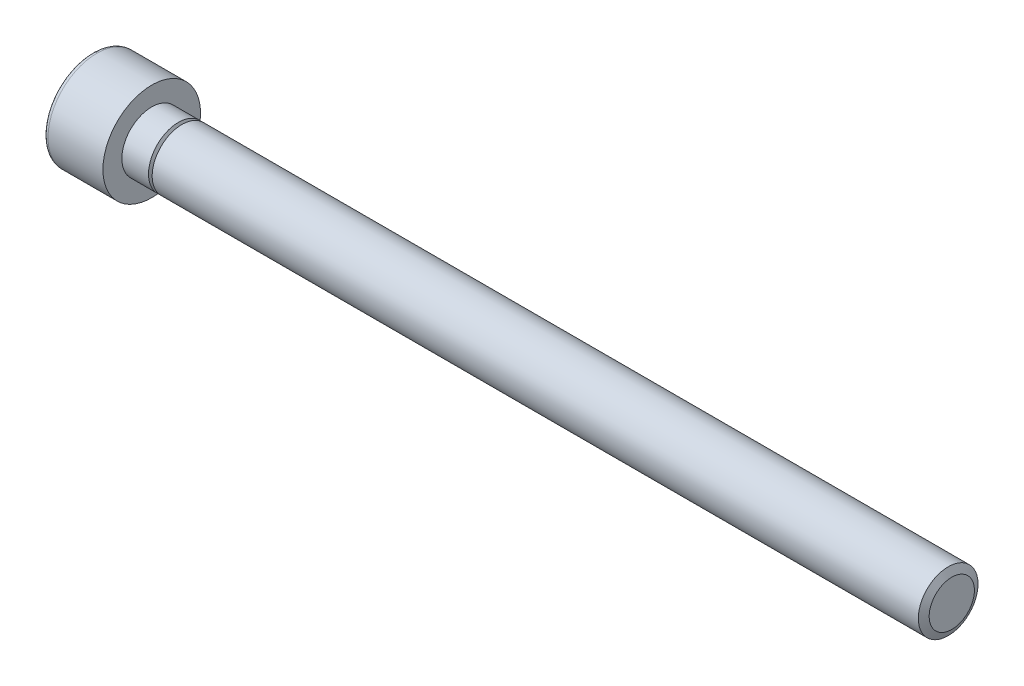
ISO-10303-21;
HEADER;
FILE_DESCRIPTION(('STEP AP214'),'2;1');
FILE_NAME('part.step','',(''),(''),'','','');
FILE_SCHEMA(('AUTOMOTIVE_DESIGN { 1 0 10303 214 1 1 1 1 }'));
ENDSEC;
DATA;
#1=APPLICATION_CONTEXT('core data for automotive mechanical design processes');
#2=APPLICATION_PROTOCOL_DEFINITION('international standard','automotive_design',2000,#1);
#3=PRODUCT_CONTEXT('',#1,'mechanical');
#4=PRODUCT('Part','Part','',(#3));
#5=PRODUCT_RELATED_PRODUCT_CATEGORY('part','',(#4));
#6=PRODUCT_DEFINITION_FORMATION('','',#4);
#7=PRODUCT_DEFINITION_CONTEXT('part definition',#1,'design');
#8=PRODUCT_DEFINITION('design','',#6,#7);
#9=PRODUCT_DEFINITION_SHAPE('','',#8);
#10=(LENGTH_UNIT() NAMED_UNIT(*) SI_UNIT(.MILLI.,.METRE.));
#11=(NAMED_UNIT(*) PLANE_ANGLE_UNIT() SI_UNIT($,.RADIAN.));
#12=(NAMED_UNIT(*) SI_UNIT($,.STERADIAN.) SOLID_ANGLE_UNIT());
#13=UNCERTAINTY_MEASURE_WITH_UNIT(LENGTH_MEASURE(1.E-05),#10,'distance_accuracy_value','');
#14=(GEOMETRIC_REPRESENTATION_CONTEXT(3) GLOBAL_UNCERTAINTY_ASSIGNED_CONTEXT((#13)) GLOBAL_UNIT_ASSIGNED_CONTEXT((#10,
#11,#12)) REPRESENTATION_CONTEXT('',''));
#15=CARTESIAN_POINT('',(0.,0.,0.));
#16=DIRECTION('',(0.,0.,1.));
#17=DIRECTION('',(1.,0.,0.));
#18=AXIS2_PLACEMENT_3D('',#15,#16,#17);
#19=CARTESIAN_POINT('',(-2.8448,0.,0.));
#20=DIRECTION('',(-1.,0.,0.));
#21=DIRECTION('',(0.,0.,1.));
#22=AXIS2_PLACEMENT_3D('',#19,#20,#21);
#23=PLANE('',#22);
#24=CARTESIAN_POINT('',(-2.8448,0.,0.));
#25=DIRECTION('',(-1.,0.,0.));
#26=DIRECTION('',(0.,0.,1.));
#27=AXIS2_PLACEMENT_3D('',#24,#25,#26);
#28=CIRCLE('',#27,2.0955);
#29=CARTESIAN_POINT('',(-2.8448,0.,2.0955));
#30=VERTEX_POINT('',#29);
#31=EDGE_CURVE('E105',#30,#30,#28,.T.);
#32=ORIENTED_EDGE('',*,*,#31,.T.);
#33=EDGE_LOOP('',(#32));
#34=FACE_BOUND('',#33,.T.);
#35=DIRECTION('',(0.,-1.,0.));
#36=VECTOR('',#35,1.);
#37=CARTESIAN_POINT('',(-2.8448,0.,1.1938));
#38=LINE('',#37,#36);
#39=CARTESIAN_POINT('',(-2.8448,0.689240751358576,1.1938));
#40=VERTEX_POINT('',#39);
#41=CARTESIAN_POINT('',(-2.8448,-0.689240751358574,1.1938));
#42=VERTEX_POINT('',#41);
#43=EDGE_CURVE('E133',#40,#42,#38,.T.);
#44=ORIENTED_EDGE('',*,*,#43,.T.);
#45=DIRECTION('',(0.,-0.5,-0.866025403784439));
#46=VECTOR('',#45,1.);
#47=CARTESIAN_POINT('',(-2.8448,-1.03386112703786,0.5969));
#48=LINE('',#47,#46);
#49=CARTESIAN_POINT('',(-2.8448,-1.37848150271715,0.));
#50=VERTEX_POINT('',#49);
#51=EDGE_CURVE('E9',#42,#50,#48,.T.);
#52=ORIENTED_EDGE('',*,*,#51,.T.);
#53=DIRECTION('',(0.,0.5,-0.866025403784439));
#54=VECTOR('',#53,1.);
#55=CARTESIAN_POINT('',(-2.8448,-1.03386112703786,-0.5969));
#56=LINE('',#55,#54);
#57=CARTESIAN_POINT('',(-2.8448,-0.689240751358576,-1.1938));
#58=VERTEX_POINT('',#57);
#59=EDGE_CURVE('E24',#50,#58,#56,.T.);
#60=ORIENTED_EDGE('',*,*,#59,.T.);
#61=DIRECTION('',(0.,1.,0.));
#62=VECTOR('',#61,1.);
#63=CARTESIAN_POINT('',(-2.8448,0.,-1.1938));
#64=LINE('',#63,#62);
#65=CARTESIAN_POINT('',(-2.8448,0.689240751358575,-1.1938));
#66=VERTEX_POINT('',#65);
#67=EDGE_CURVE('E145',#58,#66,#64,.T.);
#68=ORIENTED_EDGE('',*,*,#67,.T.);
#69=DIRECTION('',(0.,0.5,0.866025403784439));
#70=VECTOR('',#69,1.);
#71=CARTESIAN_POINT('',(-2.8448,1.03386112703786,-0.5969));
#72=LINE('',#71,#70);
#73=CARTESIAN_POINT('',(-2.8448,1.37848150271715,0.));
#74=VERTEX_POINT('',#73);
#75=EDGE_CURVE('E141',#66,#74,#72,.T.);
#76=ORIENTED_EDGE('',*,*,#75,.T.);
#77=DIRECTION('',(0.,-0.5,0.866025403784439));
#78=VECTOR('',#77,1.);
#79=CARTESIAN_POINT('',(-2.8448,1.03386112703786,0.5969));
#80=LINE('',#79,#78);
#81=EDGE_CURVE('E137',#74,#40,#80,.T.);
#82=ORIENTED_EDGE('',*,*,#81,.T.);
#83=EDGE_LOOP('',(#44,#52,#60,#68,#76,#82));
#84=FACE_BOUND('',#83,.T.);
#85=ADVANCED_FACE('F15',(#34,#84),#23,.T.);
#86=CARTESIAN_POINT('',(0.,-2.3241,0.));
#87=DIRECTION('',(1.,0.,0.));
#88=DIRECTION('',(0.,0.,-1.));
#89=AXIS2_PLACEMENT_3D('',#86,#87,#88);
#90=PLANE('',#89);
#91=CARTESIAN_POINT('',(0.,0.,0.));
#92=DIRECTION('',(-1.,0.,0.));
#93=DIRECTION('',(0.,0.,1.));
#94=AXIS2_PLACEMENT_3D('',#91,#92,#93);
#95=CIRCLE('',#94,1.4224);
#96=CARTESIAN_POINT('',(0.,0.,1.4224));
#97=VERTEX_POINT('',#96);
#98=EDGE_CURVE('E129',#97,#97,#95,.T.);
#99=ORIENTED_EDGE('',*,*,#98,.T.);
#100=EDGE_LOOP('',(#99));
#101=FACE_BOUND('',#100,.T.);
#102=CARTESIAN_POINT('',(0.,0.,0.));
#103=DIRECTION('',(-1.,0.,0.));
#104=DIRECTION('',(0.,0.,1.));
#105=AXIS2_PLACEMENT_3D('',#102,#103,#104);
#106=CIRCLE('',#105,2.3241);
#107=CARTESIAN_POINT('',(0.,0.,2.3241));
#108=VERTEX_POINT('',#107);
#109=EDGE_CURVE('E87',#108,#108,#106,.T.);
#110=ORIENTED_EDGE('',*,*,#109,.F.);
#111=EDGE_LOOP('',(#110));
#112=FACE_BOUND('',#111,.T.);
#113=ADVANCED_FACE('F17',(#101,#112),#90,.T.);
#114=CARTESIAN_POINT('',(-2.8448,0.,0.));
#115=DIRECTION('',(-1.,0.,0.));
#116=DIRECTION('',(0.,0.,1.));
#117=AXIS2_PLACEMENT_3D('',#114,#115,#116);
#118=CYLINDRICAL_SURFACE('',#117,1.4224);
#119=CARTESIAN_POINT('',(1.27,0.,0.));
#120=DIRECTION('',(-1.,0.,0.));
#121=DIRECTION('',(0.,0.,1.));
#122=AXIS2_PLACEMENT_3D('',#119,#120,#121);
#123=CIRCLE('',#122,1.4224);
#124=CARTESIAN_POINT('',(1.27,0.,1.4224));
#125=VERTEX_POINT('',#124);
#126=EDGE_CURVE('E125',#125,#125,#123,.T.);
#127=ORIENTED_EDGE('',*,*,#126,.T.);
#128=EDGE_LOOP('',(#127));
#129=FACE_BOUND('',#128,.T.);
#130=ORIENTED_EDGE('',*,*,#98,.F.);
#131=EDGE_LOOP('',(#130));
#132=FACE_BOUND('',#131,.T.);
#133=ADVANCED_FACE('F317',(#129,#132),#118,.T.);
#134=CARTESIAN_POINT('',(1.27,0.,0.));
#135=DIRECTION('',(-1.,0.,0.));
#136=DIRECTION('',(0.,0.,1.));
#137=AXIS2_PLACEMENT_3D('',#134,#135,#136);
#138=CONICAL_SURFACE('',#137,1.4224,1.10714871779409);
#139=CARTESIAN_POINT('',(1.442085,0.,0.));
#140=DIRECTION('',(-1.,0.,0.));
#141=DIRECTION('',(0.,0.,1.));
#142=AXIS2_PLACEMENT_3D('',#139,#140,#141);
#143=CIRCLE('',#142,1.07823);
#144=CARTESIAN_POINT('',(1.442085,0.,1.07823));
#145=VERTEX_POINT('',#144);
#146=EDGE_CURVE('E121',#145,#145,#143,.T.);
#147=ORIENTED_EDGE('',*,*,#146,.T.);
#148=EDGE_LOOP('',(#147));
#149=FACE_BOUND('',#148,.T.);
#150=ORIENTED_EDGE('',*,*,#126,.F.);
#151=EDGE_LOOP('',(#150));
#152=FACE_BOUND('',#151,.T.);
#153=ADVANCED_FACE('F307',(#149,#152),#138,.T.);
#154=CARTESIAN_POINT('',(1.442085,-1.07823,0.));
#155=DIRECTION('',(-1.,0.,0.));
#156=DIRECTION('',(0.,0.,1.));
#157=AXIS2_PLACEMENT_3D('',#154,#155,#156);
#158=PLANE('',#157);
#159=CARTESIAN_POINT('',(1.442085,0.,0.));
#160=DIRECTION('',(-1.,0.,0.));
#161=DIRECTION('',(0.,0.,1.));
#162=AXIS2_PLACEMENT_3D('',#159,#160,#161);
#163=CIRCLE('',#162,1.4224);
#164=CARTESIAN_POINT('',(1.442085,0.,1.4224));
#165=VERTEX_POINT('',#164);
#166=EDGE_CURVE('E117',#165,#165,#163,.T.);
#167=ORIENTED_EDGE('',*,*,#166,.T.);
#168=EDGE_LOOP('',(#167));
#169=FACE_BOUND('',#168,.T.);
#170=ORIENTED_EDGE('',*,*,#146,.F.);
#171=EDGE_LOOP('',(#170));
#172=FACE_BOUND('',#171,.T.);
#173=ADVANCED_FACE('F297',(#169,#172),#158,.T.);
#174=CARTESIAN_POINT('',(-2.8448,0.,0.));
#175=DIRECTION('',(-1.,0.,0.));
#176=DIRECTION('',(0.,0.,1.));
#177=AXIS2_PLACEMENT_3D('',#174,#175,#176);
#178=CYLINDRICAL_SURFACE('',#177,1.4224);
#179=CARTESIAN_POINT('',(37.927915,0.,0.));
#180=DIRECTION('',(-1.,0.,0.));
#181=DIRECTION('',(0.,0.,1.));
#182=AXIS2_PLACEMENT_3D('',#179,#180,#181);
#183=CIRCLE('',#182,1.4224);
#184=CARTESIAN_POINT('',(37.927915,0.,1.4224));
#185=VERTEX_POINT('',#184);
#186=EDGE_CURVE('E113',#185,#185,#183,.T.);
#187=ORIENTED_EDGE('',*,*,#186,.T.);
#188=EDGE_LOOP('',(#187));
#189=FACE_BOUND('',#188,.T.);
#190=ORIENTED_EDGE('',*,*,#166,.F.);
#191=EDGE_LOOP('',(#190));
#192=FACE_BOUND('',#191,.T.);
#193=ADVANCED_FACE('F287',(#189,#192),#178,.T.);
#194=CARTESIAN_POINT('',(37.927915,0.,0.));
#195=DIRECTION('',(-1.,0.,0.));
#196=DIRECTION('',(0.,0.,1.));
#197=AXIS2_PLACEMENT_3D('',#194,#195,#196);
#198=CONICAL_SURFACE('',#197,1.4224,1.1071487177941);
#199=CARTESIAN_POINT('',(38.1,0.,0.));
#200=DIRECTION('',(-1.,0.,0.));
#201=DIRECTION('',(0.,0.,1.));
#202=AXIS2_PLACEMENT_3D('',#199,#200,#201);
#203=CIRCLE('',#202,1.07823);
#204=CARTESIAN_POINT('',(38.1,0.,1.07823));
#205=VERTEX_POINT('',#204);
#206=EDGE_CURVE('E109',#205,#205,#203,.T.);
#207=ORIENTED_EDGE('',*,*,#206,.T.);
#208=EDGE_LOOP('',(#207));
#209=FACE_BOUND('',#208,.T.);
#210=ORIENTED_EDGE('',*,*,#186,.F.);
#211=EDGE_LOOP('',(#210));
#212=FACE_BOUND('',#211,.T.);
#213=ADVANCED_FACE('F277',(#209,#212),#198,.T.);
#214=CARTESIAN_POINT('',(38.1,-1.07823,0.));
#215=DIRECTION('',(1.,0.,0.));
#216=DIRECTION('',(0.,0.,-1.));
#217=AXIS2_PLACEMENT_3D('',#214,#215,#216);
#218=PLANE('',#217);
#219=ORIENTED_EDGE('',*,*,#206,.F.);
#220=EDGE_LOOP('',(#219));
#221=FACE_BOUND('',#220,.T.);
#222=ADVANCED_FACE('F267',(#221),#218,.T.);
#223=CARTESIAN_POINT('',(-2.6162,0.,0.));
#224=DIRECTION('',(-1.,0.,0.));
#225=DIRECTION('',(0.,0.,1.));
#226=AXIS2_PLACEMENT_3D('',#223,#224,#225);
#227=TOROIDAL_SURFACE('',#226,2.0955,0.2286);
#228=CARTESIAN_POINT('',(-2.6162,0.,0.));
#229=DIRECTION('',(-1.,0.,0.));
#230=DIRECTION('',(0.,0.,1.));
#231=AXIS2_PLACEMENT_3D('',#228,#229,#230);
#232=CIRCLE('',#231,2.3241);
#233=CARTESIAN_POINT('',(-2.6162,0.,2.3241));
#234=VERTEX_POINT('',#233);
#235=EDGE_CURVE('E95',#234,#234,#232,.T.);
#236=ORIENTED_EDGE('',*,*,#235,.T.);
#237=EDGE_LOOP('',(#236));
#238=FACE_BOUND('',#237,.T.);
#239=ORIENTED_EDGE('',*,*,#31,.F.);
#240=EDGE_LOOP('',(#239));
#241=FACE_BOUND('',#240,.T.);
#242=ADVANCED_FACE('F257',(#238,#241),#227,.T.);
#243=CARTESIAN_POINT('',(-2.8448,0.,0.));
#244=DIRECTION('',(-1.,0.,0.));
#245=DIRECTION('',(0.,0.,1.));
#246=AXIS2_PLACEMENT_3D('',#243,#244,#245);
#247=CYLINDRICAL_SURFACE('',#246,2.3241);
#248=ORIENTED_EDGE('',*,*,#109,.T.);
#249=EDGE_LOOP('',(#248));
#250=FACE_BOUND('',#249,.T.);
#251=ORIENTED_EDGE('',*,*,#235,.F.);
#252=EDGE_LOOP('',(#251));
#253=FACE_BOUND('',#252,.T.);
#254=ADVANCED_FACE('F248',(#250,#253),#247,.T.);
#255=CARTESIAN_POINT('',(-1.5494,-0.689240751358574,1.1938));
#256=DIRECTION('',(0.,0.866025403784439,-0.5));
#257=DIRECTION('',(0.,0.5,0.866025403784439));
#258=AXIS2_PLACEMENT_3D('',#255,#256,#257);
#259=PLANE('',#258);
#260=DIRECTION('',(-1.,0.,0.));
#261=VECTOR('',#260,1.);
#262=CARTESIAN_POINT('',(-1.5494,-0.689240751358574,1.1938));
#263=LINE('',#262,#261);
#264=CARTESIAN_POINT('',(-1.5494,-0.689240751358574,1.1938));
#265=VERTEX_POINT('',#264);
#266=EDGE_CURVE('E31',#265,#42,#263,.T.);
#267=ORIENTED_EDGE('',*,*,#266,.F.);
#268=DIRECTION('',(0.,-0.5,-0.866025403784439));
#269=VECTOR('',#268,1.);
#270=CARTESIAN_POINT('',(-1.5494,-0.689240751358574,1.1938));
#271=LINE('',#270,#269);
#272=CARTESIAN_POINT('',(-1.5494,-1.37848150271715,0.));
#273=VERTEX_POINT('',#272);
#274=EDGE_CURVE('E74',#265,#273,#271,.T.);
#275=ORIENTED_EDGE('',*,*,#274,.T.);
#276=DIRECTION('',(-1.,0.,0.));
#277=VECTOR('',#276,1.);
#278=CARTESIAN_POINT('',(-1.5494,-1.37848150271715,0.));
#279=LINE('',#278,#277);
#280=EDGE_CURVE('E82',#273,#50,#279,.T.);
#281=ORIENTED_EDGE('',*,*,#280,.T.);
#282=ORIENTED_EDGE('',*,*,#51,.F.);
#283=EDGE_LOOP('',(#267,#275,#281,#282));
#284=FACE_BOUND('',#283,.T.);
#285=ADVANCED_FACE('F81',(#284),#259,.T.);
#286=CARTESIAN_POINT('',(-1.5494,-1.37848150271715,0.));
#287=DIRECTION('',(0.,0.866025403784439,0.5));
#288=DIRECTION('',(0.,-0.5,0.866025403784439));
#289=AXIS2_PLACEMENT_3D('',#286,#287,#288);
#290=PLANE('',#289);
#291=ORIENTED_EDGE('',*,*,#280,.F.);
#292=DIRECTION('',(0.,0.5,-0.866025403784439));
#293=VECTOR('',#292,1.);
#294=CARTESIAN_POINT('',(-1.5494,-1.37848150271715,0.));
#295=LINE('',#294,#293);
#296=CARTESIAN_POINT('',(-1.5494,-0.689240751358576,-1.1938));
#297=VERTEX_POINT('',#296);
#298=EDGE_CURVE('E70',#273,#297,#295,.T.);
#299=ORIENTED_EDGE('',*,*,#298,.T.);
#300=DIRECTION('',(-1.,0.,0.));
#301=VECTOR('',#300,1.);
#302=CARTESIAN_POINT('',(-1.5494,-0.689240751358576,-1.1938));
#303=LINE('',#302,#301);
#304=EDGE_CURVE('E88',#297,#58,#303,.T.);
#305=ORIENTED_EDGE('',*,*,#304,.T.);
#306=ORIENTED_EDGE('',*,*,#59,.F.);
#307=EDGE_LOOP('',(#291,#299,#305,#306));
#308=FACE_BOUND('',#307,.T.);
#309=ADVANCED_FACE('F85',(#308),#290,.T.);
#310=CARTESIAN_POINT('',(-1.5494,-0.689240751358576,-1.1938));
#311=DIRECTION('',(0.,0.,1.));
#312=DIRECTION('',(0.,-1.,0.));
#313=AXIS2_PLACEMENT_3D('',#310,#311,#312);
#314=PLANE('',#313);
#315=ORIENTED_EDGE('',*,*,#304,.F.);
#316=DIRECTION('',(0.,1.,0.));
#317=VECTOR('',#316,1.);
#318=CARTESIAN_POINT('',(-1.5494,-0.689240751358576,-1.1938));
#319=LINE('',#318,#317);
#320=CARTESIAN_POINT('',(-1.5494,0.689240751358575,-1.1938));
#321=VERTEX_POINT('',#320);
#322=EDGE_CURVE('E76',#297,#321,#319,.T.);
#323=ORIENTED_EDGE('',*,*,#322,.T.);
#324=DIRECTION('',(-1.,0.,0.));
#325=VECTOR('',#324,1.);
#326=CARTESIAN_POINT('',(-1.5494,0.689240751358575,-1.1938));
#327=LINE('',#326,#325);
#328=EDGE_CURVE('E98',#321,#66,#327,.T.);
#329=ORIENTED_EDGE('',*,*,#328,.T.);
#330=ORIENTED_EDGE('',*,*,#67,.F.);
#331=EDGE_LOOP('',(#315,#323,#329,#330));
#332=FACE_BOUND('',#331,.T.);
#333=ADVANCED_FACE('F179',(#332),#314,.T.);
#334=CARTESIAN_POINT('',(-1.5494,0.689240751358575,-1.1938));
#335=DIRECTION('',(0.,-0.866025403784439,0.5));
#336=DIRECTION('',(0.,-0.5,-0.866025403784439));
#337=AXIS2_PLACEMENT_3D('',#334,#335,#336);
#338=PLANE('',#337);
#339=ORIENTED_EDGE('',*,*,#328,.F.);
#340=DIRECTION('',(0.,0.5,0.866025403784439));
#341=VECTOR('',#340,1.);
#342=CARTESIAN_POINT('',(-1.5494,0.689240751358575,-1.1938));
#343=LINE('',#342,#341);
#344=CARTESIAN_POINT('',(-1.5494,1.37848150271715,0.));
#345=VERTEX_POINT('',#344);
#346=EDGE_CURVE('E182',#321,#345,#343,.T.);
#347=ORIENTED_EDGE('',*,*,#346,.T.);
#348=DIRECTION('',(-1.,0.,0.));
#349=VECTOR('',#348,1.);
#350=CARTESIAN_POINT('',(-1.5494,1.37848150271715,0.));
#351=LINE('',#350,#349);
#352=EDGE_CURVE('E162',#345,#74,#351,.T.);
#353=ORIENTED_EDGE('',*,*,#352,.T.);
#354=ORIENTED_EDGE('',*,*,#75,.F.);
#355=EDGE_LOOP('',(#339,#347,#353,#354));
#356=FACE_BOUND('',#355,.T.);
#357=ADVANCED_FACE('F181',(#356),#338,.T.);
#358=CARTESIAN_POINT('',(-1.5494,1.37848150271715,0.));
#359=DIRECTION('',(0.,-0.866025403784439,-0.5));
#360=DIRECTION('',(0.,0.5,-0.866025403784439));
#361=AXIS2_PLACEMENT_3D('',#358,#359,#360);
#362=PLANE('',#361);
#363=ORIENTED_EDGE('',*,*,#352,.F.);
#364=DIRECTION('',(0.,-0.5,0.866025403784439));
#365=VECTOR('',#364,1.);
#366=CARTESIAN_POINT('',(-1.5494,1.37848150271715,0.));
#367=LINE('',#366,#365);
#368=CARTESIAN_POINT('',(-1.5494,0.689240751358576,1.1938));
#369=VERTEX_POINT('',#368);
#370=EDGE_CURVE('E160',#345,#369,#367,.T.);
#371=ORIENTED_EDGE('',*,*,#370,.T.);
#372=DIRECTION('',(-1.,0.,0.));
#373=VECTOR('',#372,1.);
#374=CARTESIAN_POINT('',(-1.5494,0.689240751358576,1.1938));
#375=LINE('',#374,#373);
#376=EDGE_CURVE('E154',#369,#40,#375,.T.);
#377=ORIENTED_EDGE('',*,*,#376,.T.);
#378=ORIENTED_EDGE('',*,*,#81,.F.);
#379=EDGE_LOOP('',(#363,#371,#377,#378));
#380=FACE_BOUND('',#379,.T.);
#381=ADVANCED_FACE('F157',(#380),#362,.T.);
#382=CARTESIAN_POINT('',(-1.5494,0.689240751358576,1.1938));
#383=DIRECTION('',(0.,0.,-1.));
#384=DIRECTION('',(0.,1.,0.));
#385=AXIS2_PLACEMENT_3D('',#382,#383,#384);
#386=PLANE('',#385);
#387=ORIENTED_EDGE('',*,*,#376,.F.);
#388=DIRECTION('',(0.,-1.,0.));
#389=VECTOR('',#388,1.);
#390=CARTESIAN_POINT('',(-1.5494,0.689240751358576,1.1938));
#391=LINE('',#390,#389);
#392=EDGE_CURVE('E170',#369,#265,#391,.T.);
#393=ORIENTED_EDGE('',*,*,#392,.T.);
#394=ORIENTED_EDGE('',*,*,#266,.T.);
#395=ORIENTED_EDGE('',*,*,#43,.F.);
#396=EDGE_LOOP('',(#387,#393,#394,#395));
#397=FACE_BOUND('',#396,.T.);
#398=ADVANCED_FACE('F153',(#397),#386,.T.);
#399=CARTESIAN_POINT('',(-1.5494,-0.689240751358574,1.1938));
#400=DIRECTION('',(-1.,0.,0.));
#401=DIRECTION('',(0.,0.,-1.));
#402=AXIS2_PLACEMENT_3D('',#399,#400,#401);
#403=PLANE('',#402);
#404=ORIENTED_EDGE('',*,*,#274,.F.);
#405=ORIENTED_EDGE('',*,*,#392,.F.);
#406=ORIENTED_EDGE('',*,*,#370,.F.);
#407=ORIENTED_EDGE('',*,*,#346,.F.);
#408=ORIENTED_EDGE('',*,*,#322,.F.);
#409=ORIENTED_EDGE('',*,*,#298,.F.);
#410=EDGE_LOOP('',(#404,#405,#406,#407,#408,#409));
#411=FACE_BOUND('',#410,.T.);
#412=ADVANCED_FACE('F72',(#411),#403,.T.);
#413=CLOSED_SHELL('',(#85,#113,#133,#153,#173,#193,#213,#222,#242,#254,#285,#309,#333,#357,#381,
#398,#412));
#414=MANIFOLD_SOLID_BREP('B1',#413);
#415=ADVANCED_BREP_SHAPE_REPRESENTATION('',(#18,#414),#14);
#416=SHAPE_DEFINITION_REPRESENTATION(#9,#415);
ENDSEC;
END-ISO-10303-21;
